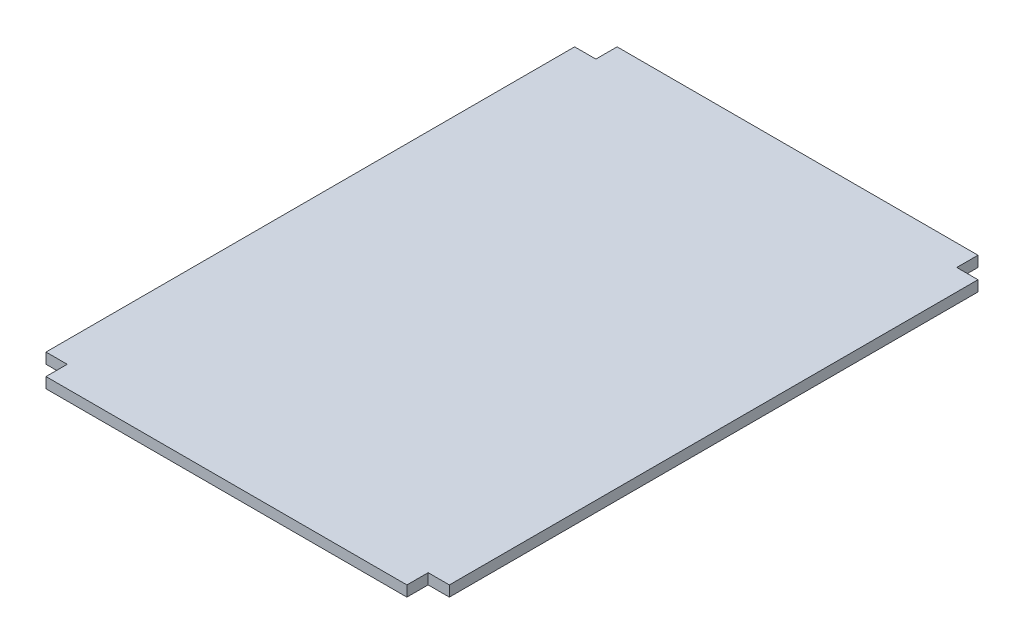
ISO-10303-21;
HEADER;
FILE_DESCRIPTION(('STEP AP214'),'2;1');
FILE_NAME('part.step','',(''),(''),'','','');
FILE_SCHEMA(('AUTOMOTIVE_DESIGN { 1 0 10303 214 1 1 1 1 }'));
ENDSEC;
DATA;
#1=APPLICATION_CONTEXT('core data for automotive mechanical design processes');
#2=APPLICATION_PROTOCOL_DEFINITION('international standard','automotive_design',2000,#1);
#3=PRODUCT_CONTEXT('',#1,'mechanical');
#4=PRODUCT('Part','Part','',(#3));
#5=PRODUCT_RELATED_PRODUCT_CATEGORY('part','',(#4));
#6=PRODUCT_DEFINITION_FORMATION('','',#4);
#7=PRODUCT_DEFINITION_CONTEXT('part definition',#1,'design');
#8=PRODUCT_DEFINITION('design','',#6,#7);
#9=PRODUCT_DEFINITION_SHAPE('','',#8);
#10=(LENGTH_UNIT() NAMED_UNIT(*) SI_UNIT(.MILLI.,.METRE.));
#11=(NAMED_UNIT(*) PLANE_ANGLE_UNIT() SI_UNIT($,.RADIAN.));
#12=(NAMED_UNIT(*) SI_UNIT($,.STERADIAN.) SOLID_ANGLE_UNIT());
#13=UNCERTAINTY_MEASURE_WITH_UNIT(LENGTH_MEASURE(1.E-05),#10,'distance_accuracy_value','');
#14=(GEOMETRIC_REPRESENTATION_CONTEXT(3) GLOBAL_UNCERTAINTY_ASSIGNED_CONTEXT((#13)) GLOBAL_UNIT_ASSIGNED_CONTEXT((#10,
#11,#12)) REPRESENTATION_CONTEXT('',''));
#15=CARTESIAN_POINT('',(0.,0.,0.));
#16=DIRECTION('',(0.,0.,1.));
#17=DIRECTION('',(1.,0.,0.));
#18=AXIS2_PLACEMENT_3D('',#15,#16,#17);
#19=CARTESIAN_POINT('',(-241.3,12.7,0.));
#20=DIRECTION('',(-1.,0.,0.));
#21=DIRECTION('',(0.,0.,1.));
#22=AXIS2_PLACEMENT_3D('',#19,#20,#21);
#23=PLANE('',#22);
#24=DIRECTION('',(0.,0.,-1.));
#25=VECTOR('',#24,1.);
#26=CARTESIAN_POINT('',(-241.3,0.,0.));
#27=LINE('',#26,#25);
#28=CARTESIAN_POINT('',(-241.3,0.,316.23));
#29=VERTEX_POINT('',#28);
#30=CARTESIAN_POINT('',(-241.3,0.,-316.23));
#31=VERTEX_POINT('',#30);
#32=EDGE_CURVE('E162',#29,#31,#27,.T.);
#33=ORIENTED_EDGE('',*,*,#32,.F.);
#34=DIRECTION('',(0.,-1.,0.));
#35=VECTOR('',#34,1.);
#36=CARTESIAN_POINT('',(-241.3,12.7,316.23));
#37=LINE('',#36,#35);
#38=CARTESIAN_POINT('',(-241.3,12.7,316.23));
#39=VERTEX_POINT('',#38);
#40=EDGE_CURVE('E11',#39,#29,#37,.T.);
#41=ORIENTED_EDGE('',*,*,#40,.F.);
#42=DIRECTION('',(0.,0.,-1.));
#43=VECTOR('',#42,1.);
#44=CARTESIAN_POINT('',(-241.3,12.7,0.));
#45=LINE('',#44,#43);
#46=CARTESIAN_POINT('',(-241.3,12.7,-316.23));
#47=VERTEX_POINT('',#46);
#48=EDGE_CURVE('E192',#39,#47,#45,.T.);
#49=ORIENTED_EDGE('',*,*,#48,.T.);
#50=DIRECTION('',(0.,-1.,0.));
#51=VECTOR('',#50,1.);
#52=CARTESIAN_POINT('',(-241.3,12.7,-316.23));
#53=LINE('',#52,#51);
#54=EDGE_CURVE('E59',#47,#31,#53,.T.);
#55=ORIENTED_EDGE('',*,*,#54,.T.);
#56=EDGE_LOOP('',(#33,#41,#49,#55));
#57=FACE_BOUND('',#56,.T.);
#58=ADVANCED_FACE('F43',(#57),#23,.T.);
#59=CARTESIAN_POINT('',(6.91113832829159E-13,12.7,316.229999999999));
#60=DIRECTION('',(0.,0.,-1.));
#61=DIRECTION('',(-1.,0.,0.));
#62=AXIS2_PLACEMENT_3D('',#59,#60,#61);
#63=PLANE('',#62);
#64=DIRECTION('',(1.,0.,0.));
#65=VECTOR('',#64,1.);
#66=CARTESIAN_POINT('',(6.91113832829159E-13,0.,316.229999999999));
#67=LINE('',#66,#65);
#68=CARTESIAN_POINT('',(-215.9,0.,316.23));
#69=VERTEX_POINT('',#68);
#70=EDGE_CURVE('E164',#29,#69,#67,.T.);
#71=ORIENTED_EDGE('',*,*,#70,.T.);
#72=DIRECTION('',(0.,-1.,0.));
#73=VECTOR('',#72,1.);
#74=CARTESIAN_POINT('',(-215.9,12.7,316.23));
#75=LINE('',#74,#73);
#76=CARTESIAN_POINT('',(-215.9,12.7,316.23));
#77=VERTEX_POINT('',#76);
#78=EDGE_CURVE('E51',#77,#69,#75,.T.);
#79=ORIENTED_EDGE('',*,*,#78,.F.);
#80=DIRECTION('',(1.,0.,0.));
#81=VECTOR('',#80,1.);
#82=CARTESIAN_POINT('',(6.91113832829159E-13,12.7,316.229999999999));
#83=LINE('',#82,#81);
#84=EDGE_CURVE('E370',#39,#77,#83,.T.);
#85=ORIENTED_EDGE('',*,*,#84,.F.);
#86=ORIENTED_EDGE('',*,*,#40,.T.);
#87=EDGE_LOOP('',(#71,#79,#85,#86));
#88=FACE_BOUND('',#87,.T.);
#89=ADVANCED_FACE('F218',(#88),#63,.F.);
#90=CARTESIAN_POINT('',(-215.9,12.7,-2.35922392732844E-13));
#91=DIRECTION('',(-1.,0.,0.));
#92=DIRECTION('',(0.,0.,1.));
#93=AXIS2_PLACEMENT_3D('',#90,#91,#92);
#94=PLANE('',#93);
#95=DIRECTION('',(0.,0.,-1.));
#96=VECTOR('',#95,1.);
#97=CARTESIAN_POINT('',(-215.9,0.,-2.35922392732844E-13));
#98=LINE('',#97,#96);
#99=CARTESIAN_POINT('',(-215.9,0.,341.63));
#100=VERTEX_POINT('',#99);
#101=EDGE_CURVE('E167',#100,#69,#98,.T.);
#102=ORIENTED_EDGE('',*,*,#101,.F.);
#103=DIRECTION('',(0.,-1.,0.));
#104=VECTOR('',#103,1.);
#105=CARTESIAN_POINT('',(-215.9,12.7,341.63));
#106=LINE('',#105,#104);
#107=CARTESIAN_POINT('',(-215.9,12.7,341.63));
#108=VERTEX_POINT('',#107);
#109=EDGE_CURVE('E208',#108,#100,#106,.T.);
#110=ORIENTED_EDGE('',*,*,#109,.F.);
#111=DIRECTION('',(0.,0.,-1.));
#112=VECTOR('',#111,1.);
#113=CARTESIAN_POINT('',(-215.9,12.7,-2.35922392732844E-13));
#114=LINE('',#113,#112);
#115=EDGE_CURVE('E215',#108,#77,#114,.T.);
#116=ORIENTED_EDGE('',*,*,#115,.T.);
#117=ORIENTED_EDGE('',*,*,#78,.T.);
#118=EDGE_LOOP('',(#102,#110,#116,#117));
#119=FACE_BOUND('',#118,.T.);
#120=ADVANCED_FACE('F213',(#119),#94,.T.);
#121=CARTESIAN_POINT('',(0.,12.7,341.63));
#122=DIRECTION('',(0.,0.,-1.));
#123=DIRECTION('',(-1.,0.,0.));
#124=AXIS2_PLACEMENT_3D('',#121,#122,#123);
#125=PLANE('',#124);
#126=DIRECTION('',(1.,0.,0.));
#127=VECTOR('',#126,1.);
#128=CARTESIAN_POINT('',(0.,0.,341.63));
#129=LINE('',#128,#127);
#130=CARTESIAN_POINT('',(215.9,0.,341.63));
#131=VERTEX_POINT('',#130);
#132=EDGE_CURVE('E170',#100,#131,#129,.T.);
#133=ORIENTED_EDGE('',*,*,#132,.T.);
#134=DIRECTION('',(0.,-1.,0.));
#135=VECTOR('',#134,1.);
#136=CARTESIAN_POINT('',(215.9,12.7,341.63));
#137=LINE('',#136,#135);
#138=CARTESIAN_POINT('',(215.9,12.7,341.63));
#139=VERTEX_POINT('',#138);
#140=EDGE_CURVE('E205',#139,#131,#137,.T.);
#141=ORIENTED_EDGE('',*,*,#140,.F.);
#142=DIRECTION('',(1.,0.,0.));
#143=VECTOR('',#142,1.);
#144=CARTESIAN_POINT('',(0.,12.7,341.63));
#145=LINE('',#144,#143);
#146=EDGE_CURVE('E235',#108,#139,#145,.T.);
#147=ORIENTED_EDGE('',*,*,#146,.F.);
#148=ORIENTED_EDGE('',*,*,#109,.T.);
#149=EDGE_LOOP('',(#133,#141,#147,#148));
#150=FACE_BOUND('',#149,.T.);
#151=ADVANCED_FACE('F225',(#150),#125,.F.);
#152=CARTESIAN_POINT('',(215.9,12.7,-2.35922392732844E-13));
#153=DIRECTION('',(-1.,0.,0.));
#154=DIRECTION('',(0.,0.,1.));
#155=AXIS2_PLACEMENT_3D('',#152,#153,#154);
#156=PLANE('',#155);
#157=DIRECTION('',(0.,0.,-1.));
#158=VECTOR('',#157,1.);
#159=CARTESIAN_POINT('',(215.9,0.,-2.35922392732844E-13));
#160=LINE('',#159,#158);
#161=CARTESIAN_POINT('',(215.9,0.,316.23));
#162=VERTEX_POINT('',#161);
#163=EDGE_CURVE('E172',#131,#162,#160,.T.);
#164=ORIENTED_EDGE('',*,*,#163,.T.);
#165=DIRECTION('',(0.,-1.,0.));
#166=VECTOR('',#165,1.);
#167=CARTESIAN_POINT('',(215.9,12.7,316.23));
#168=LINE('',#167,#166);
#169=CARTESIAN_POINT('',(215.9,12.7,316.23));
#170=VERTEX_POINT('',#169);
#171=EDGE_CURVE('E203',#170,#162,#168,.T.);
#172=ORIENTED_EDGE('',*,*,#171,.F.);
#173=DIRECTION('',(0.,0.,-1.));
#174=VECTOR('',#173,1.);
#175=CARTESIAN_POINT('',(215.9,12.7,-2.35922392732844E-13));
#176=LINE('',#175,#174);
#177=EDGE_CURVE('E231',#139,#170,#176,.T.);
#178=ORIENTED_EDGE('',*,*,#177,.F.);
#179=ORIENTED_EDGE('',*,*,#140,.T.);
#180=EDGE_LOOP('',(#164,#172,#178,#179));
#181=FACE_BOUND('',#180,.T.);
#182=ADVANCED_FACE('F229',(#181),#156,.F.);
#183=CARTESIAN_POINT('',(-6.91113832829159E-13,12.7,316.229999999999));
#184=DIRECTION('',(0.,0.,1.));
#185=DIRECTION('',(1.,0.,0.));
#186=AXIS2_PLACEMENT_3D('',#183,#184,#185);
#187=PLANE('',#186);
#188=DIRECTION('',(-1.,0.,0.));
#189=VECTOR('',#188,1.);
#190=CARTESIAN_POINT('',(-6.91113832829159E-13,0.,316.229999999999));
#191=LINE('',#190,#189);
#192=CARTESIAN_POINT('',(241.3,0.,316.23));
#193=VERTEX_POINT('',#192);
#194=EDGE_CURVE('E175',#193,#162,#191,.T.);
#195=ORIENTED_EDGE('',*,*,#194,.F.);
#196=DIRECTION('',(0.,-1.,0.));
#197=VECTOR('',#196,1.);
#198=CARTESIAN_POINT('',(241.3,12.7,316.23));
#199=LINE('',#198,#197);
#200=CARTESIAN_POINT('',(241.3,12.7,316.23));
#201=VERTEX_POINT('',#200);
#202=EDGE_CURVE('E201',#201,#193,#199,.T.);
#203=ORIENTED_EDGE('',*,*,#202,.F.);
#204=DIRECTION('',(-1.,0.,0.));
#205=VECTOR('',#204,1.);
#206=CARTESIAN_POINT('',(-6.91113832829159E-13,12.7,316.229999999999));
#207=LINE('',#206,#205);
#208=EDGE_CURVE('E234',#201,#170,#207,.T.);
#209=ORIENTED_EDGE('',*,*,#208,.T.);
#210=ORIENTED_EDGE('',*,*,#171,.T.);
#211=EDGE_LOOP('',(#195,#203,#209,#210));
#212=FACE_BOUND('',#211,.T.);
#213=ADVANCED_FACE('F275',(#212),#187,.T.);
#214=CARTESIAN_POINT('',(241.3,12.7,0.));
#215=DIRECTION('',(-1.,0.,0.));
#216=DIRECTION('',(0.,0.,1.));
#217=AXIS2_PLACEMENT_3D('',#214,#215,#216);
#218=PLANE('',#217);
#219=DIRECTION('',(0.,0.,-1.));
#220=VECTOR('',#219,1.);
#221=CARTESIAN_POINT('',(241.3,0.,0.));
#222=LINE('',#221,#220);
#223=CARTESIAN_POINT('',(241.3,0.,-316.23));
#224=VERTEX_POINT('',#223);
#225=EDGE_CURVE('E178',#193,#224,#222,.T.);
#226=ORIENTED_EDGE('',*,*,#225,.T.);
#227=DIRECTION('',(0.,-1.,0.));
#228=VECTOR('',#227,1.);
#229=CARTESIAN_POINT('',(241.3,12.7,-316.23));
#230=LINE('',#229,#228);
#231=CARTESIAN_POINT('',(241.3,12.7,-316.23));
#232=VERTEX_POINT('',#231);
#233=EDGE_CURVE('E198',#232,#224,#230,.T.);
#234=ORIENTED_EDGE('',*,*,#233,.F.);
#235=DIRECTION('',(0.,0.,-1.));
#236=VECTOR('',#235,1.);
#237=CARTESIAN_POINT('',(241.3,12.7,0.));
#238=LINE('',#237,#236);
#239=EDGE_CURVE('E237',#201,#232,#238,.T.);
#240=ORIENTED_EDGE('',*,*,#239,.F.);
#241=ORIENTED_EDGE('',*,*,#202,.T.);
#242=EDGE_LOOP('',(#226,#234,#240,#241));
#243=FACE_BOUND('',#242,.T.);
#244=ADVANCED_FACE('F278',(#243),#218,.F.);
#245=CARTESIAN_POINT('',(-6.91113832829159E-13,12.7,-316.229999999999));
#246=DIRECTION('',(0.,0.,1.));
#247=DIRECTION('',(1.,0.,0.));
#248=AXIS2_PLACEMENT_3D('',#245,#246,#247);
#249=PLANE('',#248);
#250=DIRECTION('',(-1.,0.,0.));
#251=VECTOR('',#250,1.);
#252=CARTESIAN_POINT('',(-6.91113832829159E-13,0.,-316.229999999999));
#253=LINE('',#252,#251);
#254=CARTESIAN_POINT('',(215.9,0.,-316.23));
#255=VERTEX_POINT('',#254);
#256=EDGE_CURVE('E180',#224,#255,#253,.T.);
#257=ORIENTED_EDGE('',*,*,#256,.T.);
#258=DIRECTION('',(0.,-1.,0.));
#259=VECTOR('',#258,1.);
#260=CARTESIAN_POINT('',(215.9,12.7,-316.23));
#261=LINE('',#260,#259);
#262=CARTESIAN_POINT('',(215.9,12.7,-316.23));
#263=VERTEX_POINT('',#262);
#264=EDGE_CURVE('E196',#263,#255,#261,.T.);
#265=ORIENTED_EDGE('',*,*,#264,.F.);
#266=DIRECTION('',(-1.,0.,0.));
#267=VECTOR('',#266,1.);
#268=CARTESIAN_POINT('',(-6.91113832829159E-13,12.7,-316.229999999999));
#269=LINE('',#268,#267);
#270=EDGE_CURVE('E157',#232,#263,#269,.T.);
#271=ORIENTED_EDGE('',*,*,#270,.F.);
#272=ORIENTED_EDGE('',*,*,#233,.T.);
#273=EDGE_LOOP('',(#257,#265,#271,#272));
#274=FACE_BOUND('',#273,.T.);
#275=ADVANCED_FACE('F247',(#274),#249,.F.);
#276=CARTESIAN_POINT('',(215.9,12.7,2.35922392732844E-13));
#277=DIRECTION('',(1.,0.,0.));
#278=DIRECTION('',(0.,0.,-1.));
#279=AXIS2_PLACEMENT_3D('',#276,#277,#278);
#280=PLANE('',#279);
#281=DIRECTION('',(0.,0.,1.));
#282=VECTOR('',#281,1.);
#283=CARTESIAN_POINT('',(215.9,0.,2.35922392732844E-13));
#284=LINE('',#283,#282);
#285=CARTESIAN_POINT('',(215.9,0.,-341.63));
#286=VERTEX_POINT('',#285);
#287=EDGE_CURVE('E183',#286,#255,#284,.T.);
#288=ORIENTED_EDGE('',*,*,#287,.F.);
#289=DIRECTION('',(0.,-1.,0.));
#290=VECTOR('',#289,1.);
#291=CARTESIAN_POINT('',(215.9,12.7,-341.63));
#292=LINE('',#291,#290);
#293=CARTESIAN_POINT('',(215.9,12.7,-341.63));
#294=VERTEX_POINT('',#293);
#295=EDGE_CURVE('E143',#294,#286,#292,.T.);
#296=ORIENTED_EDGE('',*,*,#295,.F.);
#297=DIRECTION('',(0.,0.,1.));
#298=VECTOR('',#297,1.);
#299=CARTESIAN_POINT('',(215.9,12.7,2.35922392732844E-13));
#300=LINE('',#299,#298);
#301=EDGE_CURVE('E155',#294,#263,#300,.T.);
#302=ORIENTED_EDGE('',*,*,#301,.T.);
#303=ORIENTED_EDGE('',*,*,#264,.T.);
#304=EDGE_LOOP('',(#288,#296,#302,#303));
#305=FACE_BOUND('',#304,.T.);
#306=ADVANCED_FACE('F251',(#305),#280,.T.);
#307=CARTESIAN_POINT('',(0.,12.7,-341.63));
#308=DIRECTION('',(0.,0.,-1.));
#309=DIRECTION('',(-1.,0.,0.));
#310=AXIS2_PLACEMENT_3D('',#307,#308,#309);
#311=PLANE('',#310);
#312=DIRECTION('',(1.,0.,0.));
#313=VECTOR('',#312,1.);
#314=CARTESIAN_POINT('',(0.,0.,-341.63));
#315=LINE('',#314,#313);
#316=CARTESIAN_POINT('',(-215.9,0.,-341.63));
#317=VERTEX_POINT('',#316);
#318=EDGE_CURVE('E140',#317,#286,#315,.T.);
#319=ORIENTED_EDGE('',*,*,#318,.F.);
#320=DIRECTION('',(0.,-1.,0.));
#321=VECTOR('',#320,1.);
#322=CARTESIAN_POINT('',(-215.9,12.7,-341.63));
#323=LINE('',#322,#321);
#324=CARTESIAN_POINT('',(-215.9,12.7,-341.63));
#325=VERTEX_POINT('',#324);
#326=EDGE_CURVE('E134',#325,#317,#323,.T.);
#327=ORIENTED_EDGE('',*,*,#326,.F.);
#328=DIRECTION('',(1.,0.,0.));
#329=VECTOR('',#328,1.);
#330=CARTESIAN_POINT('',(0.,12.7,-341.63));
#331=LINE('',#330,#329);
#332=EDGE_CURVE('E138',#325,#294,#331,.T.);
#333=ORIENTED_EDGE('',*,*,#332,.T.);
#334=ORIENTED_EDGE('',*,*,#295,.T.);
#335=EDGE_LOOP('',(#319,#327,#333,#334));
#336=FACE_BOUND('',#335,.T.);
#337=ADVANCED_FACE('F136',(#336),#311,.T.);
#338=CARTESIAN_POINT('',(-215.9,12.7,2.35922392732844E-13));
#339=DIRECTION('',(1.,0.,0.));
#340=DIRECTION('',(0.,0.,-1.));
#341=AXIS2_PLACEMENT_3D('',#338,#339,#340);
#342=PLANE('',#341);
#343=DIRECTION('',(0.,0.,1.));
#344=VECTOR('',#343,1.);
#345=CARTESIAN_POINT('',(-215.9,0.,2.35922392732844E-13));
#346=LINE('',#345,#344);
#347=CARTESIAN_POINT('',(-215.9,0.,-316.23));
#348=VERTEX_POINT('',#347);
#349=EDGE_CURVE('E187',#317,#348,#346,.T.);
#350=ORIENTED_EDGE('',*,*,#349,.T.);
#351=DIRECTION('',(0.,-1.,0.));
#352=VECTOR('',#351,1.);
#353=CARTESIAN_POINT('',(-215.9,12.7,-316.23));
#354=LINE('',#353,#352);
#355=CARTESIAN_POINT('',(-215.9,12.7,-316.23));
#356=VERTEX_POINT('',#355);
#357=EDGE_CURVE('E97',#356,#348,#354,.T.);
#358=ORIENTED_EDGE('',*,*,#357,.F.);
#359=DIRECTION('',(0.,0.,1.));
#360=VECTOR('',#359,1.);
#361=CARTESIAN_POINT('',(-215.9,12.7,2.35922392732844E-13));
#362=LINE('',#361,#360);
#363=EDGE_CURVE('E145',#325,#356,#362,.T.);
#364=ORIENTED_EDGE('',*,*,#363,.F.);
#365=ORIENTED_EDGE('',*,*,#326,.T.);
#366=EDGE_LOOP('',(#350,#358,#364,#365));
#367=FACE_BOUND('',#366,.T.);
#368=ADVANCED_FACE('F146',(#367),#342,.F.);
#369=CARTESIAN_POINT('',(6.91113832829159E-13,12.7,-316.229999999999));
#370=DIRECTION('',(0.,0.,-1.));
#371=DIRECTION('',(-1.,0.,0.));
#372=AXIS2_PLACEMENT_3D('',#369,#370,#371);
#373=PLANE('',#372);
#374=DIRECTION('',(1.,0.,0.));
#375=VECTOR('',#374,1.);
#376=CARTESIAN_POINT('',(6.91113832829159E-13,0.,-316.229999999999));
#377=LINE('',#376,#375);
#378=EDGE_CURVE('E189',#31,#348,#377,.T.);
#379=ORIENTED_EDGE('',*,*,#378,.F.);
#380=ORIENTED_EDGE('',*,*,#54,.F.);
#381=DIRECTION('',(1.,0.,0.));
#382=VECTOR('',#381,1.);
#383=CARTESIAN_POINT('',(6.91113832829159E-13,12.7,-316.229999999999));
#384=LINE('',#383,#382);
#385=EDGE_CURVE('E149',#47,#356,#384,.T.);
#386=ORIENTED_EDGE('',*,*,#385,.T.);
#387=ORIENTED_EDGE('',*,*,#357,.T.);
#388=EDGE_LOOP('',(#379,#380,#386,#387));
#389=FACE_BOUND('',#388,.T.);
#390=ADVANCED_FACE('F252',(#389),#373,.T.);
#391=CARTESIAN_POINT('',(0.,12.7,0.));
#392=DIRECTION('',(0.,1.,0.));
#393=DIRECTION('',(0.,0.,1.));
#394=AXIS2_PLACEMENT_3D('',#391,#392,#393);
#395=PLANE('',#394);
#396=ORIENTED_EDGE('',*,*,#48,.F.);
#397=ORIENTED_EDGE('',*,*,#84,.T.);
#398=ORIENTED_EDGE('',*,*,#115,.F.);
#399=ORIENTED_EDGE('',*,*,#146,.T.);
#400=ORIENTED_EDGE('',*,*,#177,.T.);
#401=ORIENTED_EDGE('',*,*,#208,.F.);
#402=ORIENTED_EDGE('',*,*,#239,.T.);
#403=ORIENTED_EDGE('',*,*,#270,.T.);
#404=ORIENTED_EDGE('',*,*,#301,.F.);
#405=ORIENTED_EDGE('',*,*,#332,.F.);
#406=ORIENTED_EDGE('',*,*,#363,.T.);
#407=ORIENTED_EDGE('',*,*,#385,.F.);
#408=EDGE_LOOP('',(#396,#397,#398,#399,#400,#401,#402,#403,#404,#405,#406,#407));
#409=FACE_BOUND('',#408,.T.);
#410=ADVANCED_FACE('F153',(#409),#395,.T.);
#411=CARTESIAN_POINT('',(0.,0.,0.));
#412=DIRECTION('',(0.,1.,0.));
#413=DIRECTION('',(0.,0.,1.));
#414=AXIS2_PLACEMENT_3D('',#411,#412,#413);
#415=PLANE('',#414);
#416=ORIENTED_EDGE('',*,*,#32,.T.);
#417=ORIENTED_EDGE('',*,*,#378,.T.);
#418=ORIENTED_EDGE('',*,*,#349,.F.);
#419=ORIENTED_EDGE('',*,*,#318,.T.);
#420=ORIENTED_EDGE('',*,*,#287,.T.);
#421=ORIENTED_EDGE('',*,*,#256,.F.);
#422=ORIENTED_EDGE('',*,*,#225,.F.);
#423=ORIENTED_EDGE('',*,*,#194,.T.);
#424=ORIENTED_EDGE('',*,*,#163,.F.);
#425=ORIENTED_EDGE('',*,*,#132,.F.);
#426=ORIENTED_EDGE('',*,*,#101,.T.);
#427=ORIENTED_EDGE('',*,*,#70,.F.);
#428=EDGE_LOOP('',(#416,#417,#418,#419,#420,#421,#422,#423,#424,#425,#426,#427));
#429=FACE_BOUND('',#428,.T.);
#430=ADVANCED_FACE('F221',(#429),#415,.F.);
#431=CLOSED_SHELL('',(#58,#89,#120,#151,#182,#213,#244,#275,#306,#337,#368,#390,#410,#430));
#432=MANIFOLD_SOLID_BREP('B2',#431);
#433=ADVANCED_BREP_SHAPE_REPRESENTATION('',(#18,#432),#14);
#434=SHAPE_DEFINITION_REPRESENTATION(#9,#433);
ENDSEC;
END-ISO-10303-21;
